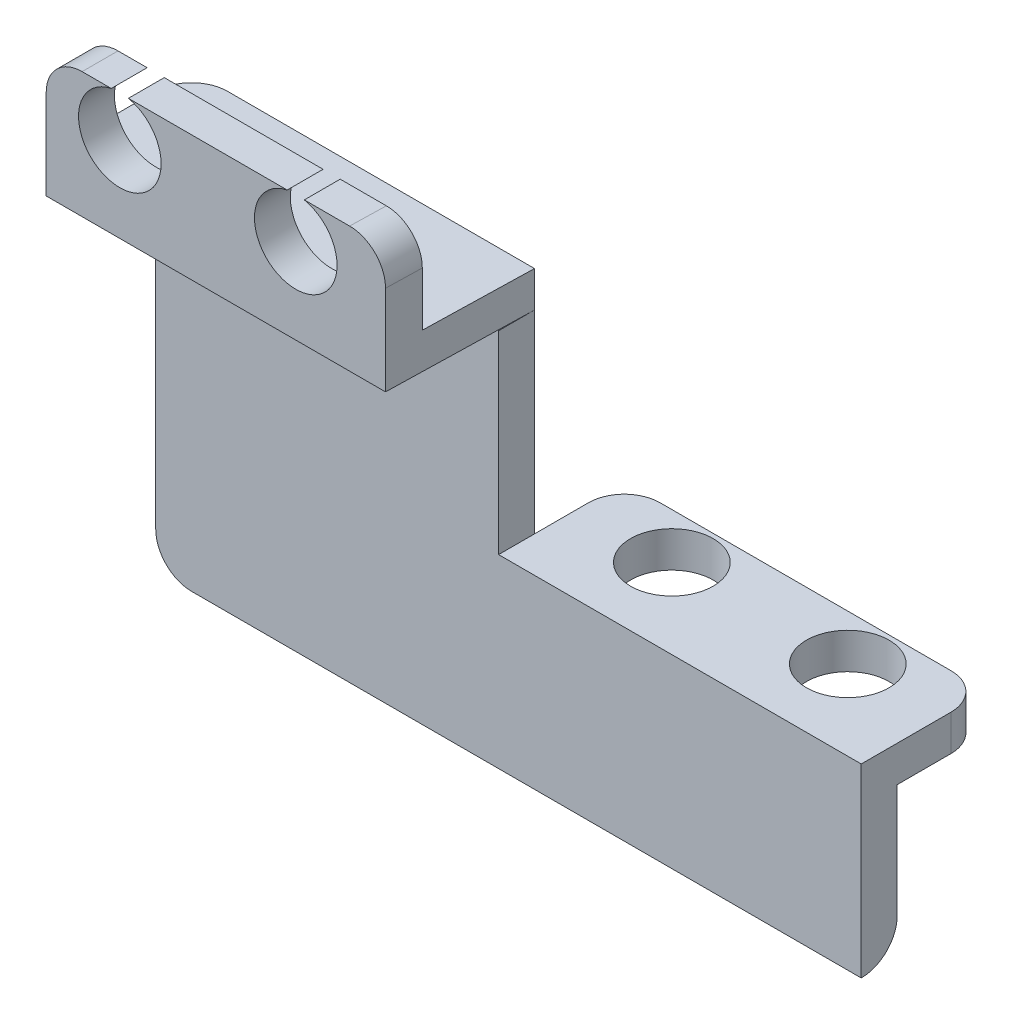
ISO-10303-21;
HEADER;
FILE_DESCRIPTION(('STEP AP214'),'2;1');
FILE_NAME('part.step','',(''),(''),'','','');
FILE_SCHEMA(('AUTOMOTIVE_DESIGN { 1 0 10303 214 1 1 1 1 }'));
ENDSEC;
DATA;
#1=APPLICATION_CONTEXT('core data for automotive mechanical design processes');
#2=APPLICATION_PROTOCOL_DEFINITION('international standard','automotive_design',2000,#1);
#3=PRODUCT_CONTEXT('',#1,'mechanical');
#4=PRODUCT('Part','Part','',(#3));
#5=PRODUCT_RELATED_PRODUCT_CATEGORY('part','',(#4));
#6=PRODUCT_DEFINITION_FORMATION('','',#4);
#7=PRODUCT_DEFINITION_CONTEXT('part definition',#1,'design');
#8=PRODUCT_DEFINITION('design','',#6,#7);
#9=PRODUCT_DEFINITION_SHAPE('','',#8);
#10=(LENGTH_UNIT() NAMED_UNIT(*) SI_UNIT(.MILLI.,.METRE.));
#11=(NAMED_UNIT(*) PLANE_ANGLE_UNIT() SI_UNIT($,.RADIAN.));
#12=(NAMED_UNIT(*) SI_UNIT($,.STERADIAN.) SOLID_ANGLE_UNIT());
#13=UNCERTAINTY_MEASURE_WITH_UNIT(LENGTH_MEASURE(1.E-05),#10,'distance_accuracy_value','');
#14=(GEOMETRIC_REPRESENTATION_CONTEXT(3) GLOBAL_UNCERTAINTY_ASSIGNED_CONTEXT((#13)) GLOBAL_UNIT_ASSIGNED_CONTEXT((#10,
#11,#12)) REPRESENTATION_CONTEXT('',''));
#15=CARTESIAN_POINT('',(0.,0.,0.));
#16=DIRECTION('',(0.,0.,1.));
#17=DIRECTION('',(1.,0.,0.));
#18=AXIS2_PLACEMENT_3D('',#15,#16,#17);
#19=CARTESIAN_POINT('',(0.,38.45,0.));
#20=DIRECTION('',(0.,1.,0.));
#21=DIRECTION('',(0.,0.,-1.));
#22=AXIS2_PLACEMENT_3D('',#19,#20,#21);
#23=PLANE('',#22);
#24=DIRECTION('',(0.,0.,-1.));
#25=VECTOR('',#24,1.);
#26=CARTESIAN_POINT('',(-15.7769696007085,38.45,6.10060938453578));
#27=LINE('',#26,#25);
#28=CARTESIAN_POINT('',(-15.7769696007085,38.45,6.1));
#29=VERTEX_POINT('',#28);
#30=CARTESIAN_POINT('',(-15.7769696007085,38.45,4.10060938453578));
#31=VERTEX_POINT('',#30);
#32=EDGE_CURVE('E11',#29,#31,#27,.T.);
#33=ORIENTED_EDGE('',*,*,#32,.T.);
#34=DIRECTION('',(1.,0.,0.));
#35=VECTOR('',#34,1.);
#36=CARTESIAN_POINT('',(-10.2506323304824,38.45,4.10060938453578));
#37=LINE('',#36,#35);
#38=CARTESIAN_POINT('',(-24.6230303992915,38.45,4.10060938453578));
#39=VERTEX_POINT('',#38);
#40=EDGE_CURVE('E210',#39,#31,#37,.T.);
#41=ORIENTED_EDGE('',*,*,#40,.F.);
#42=DIRECTION('',(0.,0.,-1.));
#43=VECTOR('',#42,1.);
#44=CARTESIAN_POINT('',(-24.6230303992915,38.45,6.10060938453578));
#45=LINE('',#44,#43);
#46=CARTESIAN_POINT('',(-24.6230303992915,38.45,6.1));
#47=VERTEX_POINT('',#46);
#48=EDGE_CURVE('E196',#39,#47,#45,.F.);
#49=ORIENTED_EDGE('',*,*,#48,.T.);
#50=DIRECTION('',(-1.,0.,0.));
#51=VECTOR('',#50,1.);
#52=CARTESIAN_POINT('',(-10.3,38.45,6.1));
#53=LINE('',#52,#51);
#54=EDGE_CURVE('E380',#29,#47,#53,.T.);
#55=ORIENTED_EDGE('',*,*,#54,.F.);
#56=EDGE_LOOP('',(#33,#41,#49,#55));
#57=FACE_BOUND('',#56,.T.);
#58=ADVANCED_FACE('F41',(#57),#23,.T.);
#59=DIRECTION('',(0.,0.,-1.));
#60=VECTOR('',#59,1.);
#61=CARTESIAN_POINT('',(-25.5769696007085,38.45,6.10060938453578));
#62=LINE('',#61,#60);
#63=CARTESIAN_POINT('',(-25.5769696007085,38.45,6.1));
#64=VERTEX_POINT('',#63);
#65=CARTESIAN_POINT('',(-25.5769696007085,38.45,4.10060938453578));
#66=VERTEX_POINT('',#65);
#67=EDGE_CURVE('E194',#64,#66,#62,.T.);
#68=ORIENTED_EDGE('',*,*,#67,.T.);
#69=CARTESIAN_POINT('',(-27.2,38.45,4.10060938453578));
#70=VERTEX_POINT('',#69);
#71=EDGE_CURVE('E201',#70,#66,#37,.T.);
#72=ORIENTED_EDGE('',*,*,#71,.F.);
#73=DIRECTION('',(0.,0.,-1.));
#74=VECTOR('',#73,1.);
#75=CARTESIAN_POINT('',(-27.2,38.45,4.10060938453578));
#76=LINE('',#75,#74);
#77=CARTESIAN_POINT('',(-27.2,38.45,6.1));
#78=VERTEX_POINT('',#77);
#79=EDGE_CURVE('E250',#78,#70,#76,.T.);
#80=ORIENTED_EDGE('',*,*,#79,.F.);
#81=EDGE_CURVE('E216',#64,#78,#53,.T.);
#82=ORIENTED_EDGE('',*,*,#81,.F.);
#83=EDGE_LOOP('',(#68,#72,#80,#82));
#84=FACE_BOUND('',#83,.T.);
#85=ADVANCED_FACE('F214',(#84),#23,.T.);
#86=CARTESIAN_POINT('',(0.,0.,-2.));
#87=DIRECTION('',(0.,0.,1.));
#88=DIRECTION('',(-1.,0.,0.));
#89=AXIS2_PLACEMENT_3D('',#86,#87,#88);
#90=PLANE('',#89);
#91=DIRECTION('',(0.,-1.,0.));
#92=VECTOR('',#91,1.);
#93=CARTESIAN_POINT('',(-27.2,0.,-2.));
#94=LINE('',#93,#92);
#95=CARTESIAN_POINT('',(-27.2,33.45,-2.));
#96=VERTEX_POINT('',#95);
#97=CARTESIAN_POINT('',(-27.2,12.325,-2.));
#98=VERTEX_POINT('',#97);
#99=EDGE_CURVE('E241',#96,#98,#94,.T.);
#100=ORIENTED_EDGE('',*,*,#99,.F.);
#101=DIRECTION('',(1.,0.,0.));
#102=VECTOR('',#101,1.);
#103=CARTESIAN_POINT('',(0.,33.45,-2.));
#104=LINE('',#103,#102);
#105=CARTESIAN_POINT('',(-10.1,33.45,-2.));
#106=VERTEX_POINT('',#105);
#107=EDGE_CURVE('E367',#96,#106,#104,.T.);
#108=ORIENTED_EDGE('',*,*,#107,.T.);
#109=DIRECTION('',(0.,-1.,0.));
#110=VECTOR('',#109,1.);
#111=CARTESIAN_POINT('',(-10.1,33.45,-2.));
#112=LINE('',#111,#110);
#113=CARTESIAN_POINT('',(-10.1,31.45,-2.));
#114=VERTEX_POINT('',#113);
#115=EDGE_CURVE('E350',#106,#114,#112,.T.);
#116=ORIENTED_EDGE('',*,*,#115,.T.);
#117=DIRECTION('',(0.,1.,0.));
#118=VECTOR('',#117,1.);
#119=CARTESIAN_POINT('',(-10.1,20.65,-2.));
#120=LINE('',#119,#118);
#121=CARTESIAN_POINT('',(-10.1,20.65,-2.));
#122=VERTEX_POINT('',#121);
#123=EDGE_CURVE('E292',#122,#114,#120,.T.);
#124=ORIENTED_EDGE('',*,*,#123,.F.);
#125=DIRECTION('',(0.,-1.,0.));
#126=VECTOR('',#125,1.);
#127=CARTESIAN_POINT('',(-10.1,20.65,-2.));
#128=LINE('',#127,#126);
#129=CARTESIAN_POINT('',(-10.1,18.65,-2.));
#130=VERTEX_POINT('',#129);
#131=EDGE_CURVE('E328',#122,#130,#128,.T.);
#132=ORIENTED_EDGE('',*,*,#131,.T.);
#133=DIRECTION('',(1.,0.,0.));
#134=VECTOR('',#133,1.);
#135=CARTESIAN_POINT('',(-10.1,18.65,-2.));
#136=LINE('',#135,#134);
#137=CARTESIAN_POINT('',(10.1,18.65,-2.));
#138=VERTEX_POINT('',#137);
#139=EDGE_CURVE('E324',#130,#138,#136,.T.);
#140=ORIENTED_EDGE('',*,*,#139,.T.);
#141=DIRECTION('',(0.,1.,0.));
#142=VECTOR('',#141,1.);
#143=CARTESIAN_POINT('',(10.1,20.65,-2.));
#144=LINE('',#143,#142);
#145=CARTESIAN_POINT('',(10.1,12.325,-2.));
#146=VERTEX_POINT('',#145);
#147=EDGE_CURVE('E296',#146,#138,#144,.T.);
#148=ORIENTED_EDGE('',*,*,#147,.F.);
#149=DIRECTION('',(1.,0.,0.));
#150=VECTOR('',#149,1.);
#151=CARTESIAN_POINT('',(0.,12.325,-2.));
#152=LINE('',#151,#150);
#153=EDGE_CURVE('E227',#98,#146,#152,.T.);
#154=ORIENTED_EDGE('',*,*,#153,.F.);
#155=EDGE_LOOP('',(#100,#108,#116,#124,#132,#140,#148,#154));
#156=FACE_BOUND('',#155,.T.);
#157=ADVANCED_FACE('F428',(#156),#90,.F.);
#158=CARTESIAN_POINT('',(10.1,20.65,-2.));
#159=DIRECTION('',(-1.,0.,0.));
#160=DIRECTION('',(0.,0.,-1.));
#161=AXIS2_PLACEMENT_3D('',#158,#159,#160);
#162=PLANE('',#161);
#163=ORIENTED_EDGE('',*,*,#147,.T.);
#164=DIRECTION('',(0.,0.,1.));
#165=VECTOR('',#164,1.);
#166=CARTESIAN_POINT('',(10.1,18.65,-7.));
#167=LINE('',#166,#165);
#168=CARTESIAN_POINT('',(10.1,18.65,-5.));
#169=VERTEX_POINT('',#168);
#170=EDGE_CURVE('E321',#169,#138,#167,.T.);
#171=ORIENTED_EDGE('',*,*,#170,.F.);
#172=DIRECTION('',(0.,1.,0.));
#173=VECTOR('',#172,1.);
#174=CARTESIAN_POINT('',(10.1,18.65,-5.));
#175=LINE('',#174,#173);
#176=CARTESIAN_POINT('',(10.1,20.65,-5.));
#177=VERTEX_POINT('',#176);
#178=EDGE_CURVE('E276',#177,#169,#175,.F.);
#179=ORIENTED_EDGE('',*,*,#178,.F.);
#180=DIRECTION('',(0.,0.,1.));
#181=VECTOR('',#180,1.);
#182=CARTESIAN_POINT('',(10.1,20.65,-2.));
#183=LINE('',#182,#181);
#184=CARTESIAN_POINT('',(10.1,20.65,0.));
#185=VERTEX_POINT('',#184);
#186=EDGE_CURVE('E283',#177,#185,#183,.T.);
#187=ORIENTED_EDGE('',*,*,#186,.T.);
#188=DIRECTION('',(0.,1.,0.));
#189=VECTOR('',#188,1.);
#190=CARTESIAN_POINT('',(10.1,20.65,0.));
#191=LINE('',#190,#189);
#192=CARTESIAN_POINT('',(10.1,10.325,0.));
#193=VERTEX_POINT('',#192);
#194=EDGE_CURVE('E307',#193,#185,#191,.T.);
#195=ORIENTED_EDGE('',*,*,#194,.F.);
#196=CARTESIAN_POINT('',(10.1,12.325,0.));
#197=DIRECTION('',(1.,0.,0.));
#198=DIRECTION('',(0.,0.,-1.));
#199=AXIS2_PLACEMENT_3D('',#196,#197,#198);
#200=CIRCLE('',#199,2.);
#201=EDGE_CURVE('E218',#146,#193,#200,.F.);
#202=ORIENTED_EDGE('',*,*,#201,.F.);
#203=EDGE_LOOP('',(#163,#171,#179,#187,#195,#202));
#204=FACE_BOUND('',#203,.T.);
#205=ADVANCED_FACE('F474',(#204),#162,.F.);
#206=CARTESIAN_POINT('',(-10.1,20.65,-2.));
#207=DIRECTION('',(0.,-1.,0.));
#208=DIRECTION('',(0.,0.,1.));
#209=AXIS2_PLACEMENT_3D('',#206,#207,#208);
#210=PLANE('',#209);
#211=CARTESIAN_POINT('',(-4.9,20.65,-4.44999999999999));
#212=DIRECTION('',(0.,1.,0.));
#213=DIRECTION('',(0.,0.,1.));
#214=AXIS2_PLACEMENT_3D('',#211,#212,#213);
#215=CIRCLE('',#214,2.3);
#216=CARTESIAN_POINT('',(-4.9,20.65,-2.14999999999999));
#217=VERTEX_POINT('',#216);
#218=EDGE_CURVE('E331',#217,#217,#215,.T.);
#219=ORIENTED_EDGE('',*,*,#218,.F.);
#220=EDGE_LOOP('',(#219));
#221=FACE_BOUND('',#220,.T.);
#222=CARTESIAN_POINT('',(4.9,20.65,-4.44999999999999));
#223=DIRECTION('',(0.,1.,0.));
#224=DIRECTION('',(0.,0.,1.));
#225=AXIS2_PLACEMENT_3D('',#222,#223,#224);
#226=CIRCLE('',#225,2.3);
#227=CARTESIAN_POINT('',(4.9,20.65,-2.14999999999999));
#228=VERTEX_POINT('',#227);
#229=EDGE_CURVE('E339',#228,#228,#226,.T.);
#230=ORIENTED_EDGE('',*,*,#229,.F.);
#231=EDGE_LOOP('',(#230));
#232=FACE_BOUND('',#231,.T.);
#233=DIRECTION('',(0.,0.,1.));
#234=VECTOR('',#233,1.);
#235=CARTESIAN_POINT('',(-10.1,20.65,-7.));
#236=LINE('',#235,#234);
#237=CARTESIAN_POINT('',(-10.1,20.65,-5.));
#238=VERTEX_POINT('',#237);
#239=EDGE_CURVE('E312',#238,#122,#236,.T.);
#240=ORIENTED_EDGE('',*,*,#239,.T.);
#241=DIRECTION('',(0.,0.,1.));
#242=VECTOR('',#241,1.);
#243=CARTESIAN_POINT('',(-10.1,20.65,-2.));
#244=LINE('',#243,#242);
#245=CARTESIAN_POINT('',(-10.1,20.65,0.));
#246=VERTEX_POINT('',#245);
#247=EDGE_CURVE('E286',#122,#246,#244,.T.);
#248=ORIENTED_EDGE('',*,*,#247,.T.);
#249=DIRECTION('',(-1.,0.,0.));
#250=VECTOR('',#249,1.);
#251=CARTESIAN_POINT('',(-10.1,20.65,0.));
#252=LINE('',#251,#250);
#253=EDGE_CURVE('E304',#185,#246,#252,.T.);
#254=ORIENTED_EDGE('',*,*,#253,.F.);
#255=ORIENTED_EDGE('',*,*,#186,.F.);
#256=CARTESIAN_POINT('',(8.1,20.65,-5.));
#257=DIRECTION('',(0.,1.,0.));
#258=DIRECTION('',(0.,0.,1.));
#259=AXIS2_PLACEMENT_3D('',#256,#257,#258);
#260=CIRCLE('',#259,2.);
#261=CARTESIAN_POINT('',(8.1,20.65,-7.));
#262=VERTEX_POINT('',#261);
#263=EDGE_CURVE('E279',#262,#177,#260,.F.);
#264=ORIENTED_EDGE('',*,*,#263,.F.);
#265=DIRECTION('',(-1.,0.,0.));
#266=VECTOR('',#265,1.);
#267=CARTESIAN_POINT('',(10.1,20.65,-7.));
#268=LINE('',#267,#266);
#269=CARTESIAN_POINT('',(-8.1,20.65,-7.));
#270=VERTEX_POINT('',#269);
#271=EDGE_CURVE('E327',#262,#270,#268,.T.);
#272=ORIENTED_EDGE('',*,*,#271,.T.);
#273=CARTESIAN_POINT('',(-8.1,20.65,-5.));
#274=DIRECTION('',(0.,1.,0.));
#275=DIRECTION('',(0.,0.,1.));
#276=AXIS2_PLACEMENT_3D('',#273,#274,#275);
#277=CIRCLE('',#276,2.);
#278=EDGE_CURVE('E264',#238,#270,#277,.F.);
#279=ORIENTED_EDGE('',*,*,#278,.F.);
#280=EDGE_LOOP('',(#240,#248,#254,#255,#264,#272,#279));
#281=FACE_BOUND('',#280,.T.);
#282=ADVANCED_FACE('F488',(#221,#232,#281),#210,.F.);
#283=CARTESIAN_POINT('',(-10.1,20.65,-2.));
#284=DIRECTION('',(-1.,0.,0.));
#285=DIRECTION('',(0.,0.,-1.));
#286=AXIS2_PLACEMENT_3D('',#283,#284,#285);
#287=PLANE('',#286);
#288=DIRECTION('',(0.,1.,0.));
#289=VECTOR('',#288,1.);
#290=CARTESIAN_POINT('',(-10.1,20.65,0.));
#291=LINE('',#290,#289);
#292=CARTESIAN_POINT('',(-10.1,31.45,0.));
#293=VERTEX_POINT('',#292);
#294=EDGE_CURVE('E301',#246,#293,#291,.T.);
#295=ORIENTED_EDGE('',*,*,#294,.F.);
#296=ORIENTED_EDGE('',*,*,#247,.F.);
#297=ORIENTED_EDGE('',*,*,#123,.T.);
#298=DIRECTION('',(0.,0.,1.));
#299=VECTOR('',#298,1.);
#300=CARTESIAN_POINT('',(-10.1,31.45,-2.));
#301=LINE('',#300,#299);
#302=EDGE_CURVE('E289',#114,#293,#301,.T.);
#303=ORIENTED_EDGE('',*,*,#302,.T.);
#304=EDGE_LOOP('',(#295,#296,#297,#303));
#305=FACE_BOUND('',#304,.T.);
#306=ADVANCED_FACE('F484',(#305),#287,.F.);
#307=CARTESIAN_POINT('',(-10.1,31.45,-2.));
#308=DIRECTION('',(0.,-1.,0.));
#309=DIRECTION('',(0.,0.,1.));
#310=AXIS2_PLACEMENT_3D('',#307,#308,#309);
#311=PLANE('',#310);
#312=DIRECTION('',(-1.,0.,0.));
#313=VECTOR('',#312,1.);
#314=CARTESIAN_POINT('',(-10.1,31.45,0.));
#315=LINE('',#314,#313);
#316=CARTESIAN_POINT('',(-10.1493827160494,31.45,0.));
#317=VERTEX_POINT('',#316);
#318=EDGE_CURVE('E297',#293,#317,#315,.T.);
#319=ORIENTED_EDGE('',*,*,#318,.F.);
#320=ORIENTED_EDGE('',*,*,#302,.F.);
#321=DIRECTION('',(0.0246838347588167,0.,-0.999695307732111));
#322=VECTOR('',#321,1.);
#323=CARTESIAN_POINT('',(-10.1431987814166,31.45,-0.250449352627562));
#324=LINE('',#323,#322);
#325=EDGE_CURVE('E263',#317,#114,#324,.T.);
#326=ORIENTED_EDGE('',*,*,#325,.F.);
#327=EDGE_LOOP('',(#319,#320,#326));
#328=FACE_BOUND('',#327,.T.);
#329=ADVANCED_FACE('F481',(#328),#311,.F.);
#330=CARTESIAN_POINT('',(-29.2,17.5673505417819,-2.));
#331=DIRECTION('',(1.,0.,0.));
#332=DIRECTION('',(0.,1.,0.));
#333=AXIS2_PLACEMENT_3D('',#330,#331,#332);
#334=PLANE('',#333);
#335=DIRECTION('',(0.,0.,-1.));
#336=VECTOR('',#335,1.);
#337=CARTESIAN_POINT('',(-29.2,31.45,0.));
#338=LINE('',#337,#336);
#339=CARTESIAN_POINT('',(-29.2,31.45,6.1));
#340=VERTEX_POINT('',#339);
#341=CARTESIAN_POINT('',(-29.2,31.45,0.));
#342=VERTEX_POINT('',#341);
#343=EDGE_CURVE('E359',#340,#342,#338,.T.);
#344=ORIENTED_EDGE('',*,*,#343,.F.);
#345=DIRECTION('',(0.,-1.,0.));
#346=VECTOR('',#345,1.);
#347=CARTESIAN_POINT('',(-29.2,33.45,6.1));
#348=LINE('',#347,#346);
#349=CARTESIAN_POINT('',(-29.2,36.45,6.1));
#350=VERTEX_POINT('',#349);
#351=EDGE_CURVE('E340',#350,#340,#348,.T.);
#352=ORIENTED_EDGE('',*,*,#351,.F.);
#353=DIRECTION('',(0.,0.,-1.));
#354=VECTOR('',#353,1.);
#355=CARTESIAN_POINT('',(-29.2,36.45,6.1));
#356=LINE('',#355,#354);
#357=CARTESIAN_POINT('',(-29.2,36.45,4.10060938453578));
#358=VERTEX_POINT('',#357);
#359=EDGE_CURVE('E246',#358,#350,#356,.F.);
#360=ORIENTED_EDGE('',*,*,#359,.F.);
#361=DIRECTION('',(0.,-1.,0.));
#362=VECTOR('',#361,1.);
#363=CARTESIAN_POINT('',(-29.2,38.45,4.10060938453578));
#364=LINE('',#363,#362);
#365=CARTESIAN_POINT('',(-29.2,33.45,4.10060938453578));
#366=VERTEX_POINT('',#365);
#367=EDGE_CURVE('E365',#358,#366,#364,.T.);
#368=ORIENTED_EDGE('',*,*,#367,.T.);
#369=DIRECTION('',(0.,0.,-1.));
#370=VECTOR('',#369,1.);
#371=CARTESIAN_POINT('',(-29.2,33.45,0.));
#372=LINE('',#371,#370);
#373=CARTESIAN_POINT('',(-29.2,33.45,0.));
#374=VERTEX_POINT('',#373);
#375=EDGE_CURVE('E358',#366,#374,#372,.T.);
#376=ORIENTED_EDGE('',*,*,#375,.T.);
#377=DIRECTION('',(0.,-1.,0.));
#378=VECTOR('',#377,1.);
#379=CARTESIAN_POINT('',(-29.2,17.5673505417819,0.));
#380=LINE('',#379,#378);
#381=EDGE_CURVE('E238',#342,#374,#380,.F.);
#382=ORIENTED_EDGE('',*,*,#381,.F.);
#383=EDGE_LOOP('',(#344,#352,#360,#368,#376,#382));
#384=FACE_BOUND('',#383,.T.);
#385=ADVANCED_FACE('F406',(#384),#334,.F.);
#386=CARTESIAN_POINT('',(0.,0.,0.));
#387=DIRECTION('',(0.,0.,1.));
#388=DIRECTION('',(-1.,0.,0.));
#389=AXIS2_PLACEMENT_3D('',#386,#387,#388);
#390=PLANE('',#389);
#391=DIRECTION('',(1.,0.,0.));
#392=VECTOR('',#391,1.);
#393=CARTESIAN_POINT('',(-10.1,10.325,0.));
#394=LINE('',#393,#392);
#395=CARTESIAN_POINT('',(-27.2,10.325,0.));
#396=VERTEX_POINT('',#395);
#397=EDGE_CURVE('E310',#396,#193,#394,.T.);
#398=ORIENTED_EDGE('',*,*,#397,.T.);
#399=ORIENTED_EDGE('',*,*,#194,.T.);
#400=ORIENTED_EDGE('',*,*,#253,.T.);
#401=ORIENTED_EDGE('',*,*,#294,.T.);
#402=ORIENTED_EDGE('',*,*,#318,.T.);
#403=EDGE_CURVE('E300',#317,#342,#315,.T.);
#404=ORIENTED_EDGE('',*,*,#403,.T.);
#405=DIRECTION('',(0.,-1.,0.));
#406=VECTOR('',#405,1.);
#407=CARTESIAN_POINT('',(-29.2,17.5673505417819,0.));
#408=LINE('',#407,#406);
#409=CARTESIAN_POINT('',(-29.2,12.325,0.));
#410=VERTEX_POINT('',#409);
#411=EDGE_CURVE('E293',#342,#410,#408,.T.);
#412=ORIENTED_EDGE('',*,*,#411,.T.);
#413=CARTESIAN_POINT('',(-27.2,12.325,0.));
#414=DIRECTION('',(0.,0.,-1.));
#415=DIRECTION('',(-1.,0.,0.));
#416=AXIS2_PLACEMENT_3D('',#413,#414,#415);
#417=CIRCLE('',#416,2.);
#418=EDGE_CURVE('E233',#396,#410,#417,.T.);
#419=ORIENTED_EDGE('',*,*,#418,.F.);
#420=EDGE_LOOP('',(#398,#399,#400,#401,#402,#404,#412,#419));
#421=FACE_BOUND('',#420,.T.);
#422=ADVANCED_FACE('F470',(#421),#390,.T.);
#423=CARTESIAN_POINT('',(-10.1,20.65,-7.));
#424=DIRECTION('',(1.,0.,0.));
#425=DIRECTION('',(0.,0.,1.));
#426=AXIS2_PLACEMENT_3D('',#423,#424,#425);
#427=PLANE('',#426);
#428=DIRECTION('',(0.,0.,1.));
#429=VECTOR('',#428,1.);
#430=CARTESIAN_POINT('',(-10.1,18.65,-7.));
#431=LINE('',#430,#429);
#432=CARTESIAN_POINT('',(-10.1,18.65,-5.));
#433=VERTEX_POINT('',#432);
#434=EDGE_CURVE('E319',#433,#130,#431,.T.);
#435=ORIENTED_EDGE('',*,*,#434,.T.);
#436=ORIENTED_EDGE('',*,*,#131,.F.);
#437=ORIENTED_EDGE('',*,*,#239,.F.);
#438=DIRECTION('',(0.,-1.,0.));
#439=VECTOR('',#438,1.);
#440=CARTESIAN_POINT('',(-10.1,20.65,-5.));
#441=LINE('',#440,#439);
#442=EDGE_CURVE('E267',#433,#238,#441,.F.);
#443=ORIENTED_EDGE('',*,*,#442,.F.);
#444=EDGE_LOOP('',(#435,#436,#437,#443));
#445=FACE_BOUND('',#444,.T.);
#446=ADVANCED_FACE('F466',(#445),#427,.F.);
#447=CARTESIAN_POINT('',(-10.1,18.65,-7.));
#448=DIRECTION('',(0.,1.,0.));
#449=DIRECTION('',(0.,0.,-1.));
#450=AXIS2_PLACEMENT_3D('',#447,#448,#449);
#451=PLANE('',#450);
#452=CARTESIAN_POINT('',(-4.9,18.65,-4.44999999999999));
#453=DIRECTION('',(0.,1.,0.));
#454=DIRECTION('',(0.,0.,1.));
#455=AXIS2_PLACEMENT_3D('',#452,#453,#454);
#456=CIRCLE('',#455,2.3);
#457=CARTESIAN_POINT('',(-4.9,18.65,-2.14999999999999));
#458=VERTEX_POINT('',#457);
#459=EDGE_CURVE('E343',#458,#458,#456,.T.);
#460=ORIENTED_EDGE('',*,*,#459,.T.);
#461=EDGE_LOOP('',(#460));
#462=FACE_BOUND('',#461,.T.);
#463=CARTESIAN_POINT('',(4.9,18.65,-4.44999999999999));
#464=DIRECTION('',(0.,1.,0.));
#465=DIRECTION('',(0.,0.,1.));
#466=AXIS2_PLACEMENT_3D('',#463,#464,#465);
#467=CIRCLE('',#466,2.3);
#468=CARTESIAN_POINT('',(4.9,18.65,-2.14999999999999));
#469=VERTEX_POINT('',#468);
#470=EDGE_CURVE('E336',#469,#469,#467,.T.);
#471=ORIENTED_EDGE('',*,*,#470,.T.);
#472=EDGE_LOOP('',(#471));
#473=FACE_BOUND('',#472,.T.);
#474=DIRECTION('',(1.,0.,0.));
#475=VECTOR('',#474,1.);
#476=CARTESIAN_POINT('',(-10.1,18.65,-7.));
#477=LINE('',#476,#475);
#478=CARTESIAN_POINT('',(-8.1,18.65,-7.));
#479=VERTEX_POINT('',#478);
#480=CARTESIAN_POINT('',(8.1,18.65,-7.));
#481=VERTEX_POINT('',#480);
#482=EDGE_CURVE('E323',#479,#481,#477,.T.);
#483=ORIENTED_EDGE('',*,*,#482,.T.);
#484=CARTESIAN_POINT('',(8.1,18.65,-5.));
#485=DIRECTION('',(0.,-1.,0.));
#486=DIRECTION('',(0.,0.,-1.));
#487=AXIS2_PLACEMENT_3D('',#484,#485,#486);
#488=CIRCLE('',#487,2.);
#489=EDGE_CURVE('E273',#169,#481,#488,.F.);
#490=ORIENTED_EDGE('',*,*,#489,.F.);
#491=ORIENTED_EDGE('',*,*,#170,.T.);
#492=ORIENTED_EDGE('',*,*,#139,.F.);
#493=ORIENTED_EDGE('',*,*,#434,.F.);
#494=CARTESIAN_POINT('',(-8.1,18.65,-5.));
#495=DIRECTION('',(0.,-1.,0.));
#496=DIRECTION('',(0.,0.,-1.));
#497=AXIS2_PLACEMENT_3D('',#494,#495,#496);
#498=CIRCLE('',#497,2.);
#499=EDGE_CURVE('E269',#479,#433,#498,.F.);
#500=ORIENTED_EDGE('',*,*,#499,.F.);
#501=EDGE_LOOP('',(#483,#490,#491,#492,#493,#500));
#502=FACE_BOUND('',#501,.T.);
#503=ADVANCED_FACE('F462',(#462,#473,#502),#451,.F.);
#504=CARTESIAN_POINT('',(0.,0.,-7.));
#505=DIRECTION('',(0.,0.,-1.));
#506=DIRECTION('',(1.,0.,0.));
#507=AXIS2_PLACEMENT_3D('',#504,#505,#506);
#508=PLANE('',#507);
#509=ORIENTED_EDGE('',*,*,#271,.F.);
#510=DIRECTION('',(0.,1.,0.));
#511=VECTOR('',#510,1.);
#512=CARTESIAN_POINT('',(8.1,20.65,-7.));
#513=LINE('',#512,#511);
#514=EDGE_CURVE('E281',#481,#262,#513,.T.);
#515=ORIENTED_EDGE('',*,*,#514,.F.);
#516=ORIENTED_EDGE('',*,*,#482,.F.);
#517=DIRECTION('',(0.,-1.,0.));
#518=VECTOR('',#517,1.);
#519=CARTESIAN_POINT('',(-8.1,18.65,-7.));
#520=LINE('',#519,#518);
#521=EDGE_CURVE('E271',#270,#479,#520,.T.);
#522=ORIENTED_EDGE('',*,*,#521,.F.);
#523=EDGE_LOOP('',(#509,#515,#516,#522));
#524=FACE_BOUND('',#523,.T.);
#525=ADVANCED_FACE('F458',(#524),#508,.T.);
#526=CARTESIAN_POINT('',(8.1,0.,-5.));
#527=DIRECTION('',(0.,-1.,0.));
#528=DIRECTION('',(0.,0.,1.));
#529=AXIS2_PLACEMENT_3D('',#526,#527,#528);
#530=CYLINDRICAL_SURFACE('',#529,2.);
#531=ORIENTED_EDGE('',*,*,#489,.T.);
#532=ORIENTED_EDGE('',*,*,#514,.T.);
#533=ORIENTED_EDGE('',*,*,#263,.T.);
#534=ORIENTED_EDGE('',*,*,#178,.T.);
#535=EDGE_LOOP('',(#531,#532,#533,#534));
#536=FACE_BOUND('',#535,.T.);
#537=ADVANCED_FACE('F461',(#536),#530,.T.);
#538=CARTESIAN_POINT('',(-8.1,0.,-5.));
#539=DIRECTION('',(0.,1.,0.));
#540=DIRECTION('',(0.,0.,-1.));
#541=AXIS2_PLACEMENT_3D('',#538,#539,#540);
#542=CYLINDRICAL_SURFACE('',#541,2.);
#543=ORIENTED_EDGE('',*,*,#278,.T.);
#544=ORIENTED_EDGE('',*,*,#521,.T.);
#545=ORIENTED_EDGE('',*,*,#499,.T.);
#546=ORIENTED_EDGE('',*,*,#442,.T.);
#547=EDGE_LOOP('',(#543,#544,#545,#546));
#548=FACE_BOUND('',#547,.T.);
#549=ADVANCED_FACE('F456',(#548),#542,.T.);
#550=CARTESIAN_POINT('',(4.9,20.65,-4.44999999999999));
#551=DIRECTION('',(0.,-1.,0.));
#552=DIRECTION('',(0.,0.,1.));
#553=AXIS2_PLACEMENT_3D('',#550,#551,#552);
#554=CYLINDRICAL_SURFACE('',#553,2.3);
#555=ORIENTED_EDGE('',*,*,#229,.T.);
#556=EDGE_LOOP('',(#555));
#557=FACE_BOUND('',#556,.T.);
#558=ORIENTED_EDGE('',*,*,#470,.F.);
#559=EDGE_LOOP('',(#558));
#560=FACE_BOUND('',#559,.T.);
#561=ADVANCED_FACE('F452',(#557,#560),#554,.F.);
#562=CARTESIAN_POINT('',(-4.9,20.65,-4.44999999999999));
#563=DIRECTION('',(0.,-1.,0.));
#564=DIRECTION('',(0.,0.,1.));
#565=AXIS2_PLACEMENT_3D('',#562,#563,#564);
#566=CYLINDRICAL_SURFACE('',#565,2.3);
#567=ORIENTED_EDGE('',*,*,#218,.T.);
#568=EDGE_LOOP('',(#567));
#569=FACE_BOUND('',#568,.T.);
#570=ORIENTED_EDGE('',*,*,#459,.F.);
#571=EDGE_LOOP('',(#570));
#572=FACE_BOUND('',#571,.T.);
#573=ADVANCED_FACE('F444',(#569,#572),#566,.F.);
#574=CARTESIAN_POINT('',(0.,31.45,0.));
#575=DIRECTION('',(0.,1.,0.));
#576=DIRECTION('',(0.,0.,-1.));
#577=AXIS2_PLACEMENT_3D('',#574,#575,#576);
#578=PLANE('',#577);
#579=CARTESIAN_POINT('',(-10.3,31.45,6.1));
#580=VERTEX_POINT('',#579);
#581=EDGE_CURVE('E356',#580,#317,#324,.T.);
#582=ORIENTED_EDGE('',*,*,#581,.F.);
#583=DIRECTION('',(1.,0.,0.));
#584=VECTOR('',#583,1.);
#585=CARTESIAN_POINT('',(0.,31.45,6.1));
#586=LINE('',#585,#584);
#587=EDGE_CURVE('E362',#340,#580,#586,.T.);
#588=ORIENTED_EDGE('',*,*,#587,.F.);
#589=ORIENTED_EDGE('',*,*,#343,.T.);
#590=ORIENTED_EDGE('',*,*,#403,.F.);
#591=EDGE_LOOP('',(#582,#588,#589,#590));
#592=FACE_BOUND('',#591,.T.);
#593=ADVANCED_FACE('F441',(#592),#578,.F.);
#594=CARTESIAN_POINT('',(0.,33.45,6.1));
#595=DIRECTION('',(0.,0.,1.));
#596=DIRECTION('',(-1.,0.,0.));
#597=AXIS2_PLACEMENT_3D('',#594,#595,#596);
#598=PLANE('',#597);
#599=CARTESIAN_POINT('',(-15.3,36.2,6.1));
#600=DIRECTION('',(0.,0.,-1.));
#601=DIRECTION('',(-1.,0.,0.));
#602=AXIS2_PLACEMENT_3D('',#599,#600,#601);
#603=CIRCLE('',#602,2.3);
#604=CARTESIAN_POINT('',(-14.8230303992915,38.45,6.1));
#605=VERTEX_POINT('',#604);
#606=EDGE_CURVE('E224',#605,#29,#603,.T.);
#607=ORIENTED_EDGE('',*,*,#606,.T.);
#608=ORIENTED_EDGE('',*,*,#54,.T.);
#609=CARTESIAN_POINT('',(-25.1,36.2,6.1));
#610=DIRECTION('',(0.,0.,-1.));
#611=DIRECTION('',(-1.,0.,0.));
#612=AXIS2_PLACEMENT_3D('',#609,#610,#611);
#613=CIRCLE('',#612,2.3);
#614=EDGE_CURVE('E382',#47,#64,#613,.T.);
#615=ORIENTED_EDGE('',*,*,#614,.T.);
#616=ORIENTED_EDGE('',*,*,#81,.T.);
#617=CARTESIAN_POINT('',(-27.2,36.45,6.1));
#618=DIRECTION('',(0.,0.,-1.));
#619=DIRECTION('',(-1.,0.,0.));
#620=AXIS2_PLACEMENT_3D('',#617,#618,#619);
#621=CIRCLE('',#620,2.);
#622=EDGE_CURVE('E244',#350,#78,#621,.T.);
#623=ORIENTED_EDGE('',*,*,#622,.F.);
#624=ORIENTED_EDGE('',*,*,#351,.T.);
#625=ORIENTED_EDGE('',*,*,#587,.T.);
#626=DIRECTION('',(0.,-1.,0.));
#627=VECTOR('',#626,1.);
#628=CARTESIAN_POINT('',(-10.3,33.45,6.1));
#629=LINE('',#628,#627);
#630=CARTESIAN_POINT('',(-10.3,36.45,6.1));
#631=VERTEX_POINT('',#630);
#632=EDGE_CURVE('E353',#631,#580,#629,.T.);
#633=ORIENTED_EDGE('',*,*,#632,.F.);
#634=CARTESIAN_POINT('',(-12.3006095702671,36.45,6.1));
#635=DIRECTION('',(0.,0.,-1.));
#636=DIRECTION('',(-1.,0.,0.));
#637=AXIS2_PLACEMENT_3D('',#634,#635,#636);
#638=ELLIPSE('',#637,2.00060957026713,2.);
#639=CARTESIAN_POINT('',(-12.3006095702671,38.45,6.1));
#640=VERTEX_POINT('',#639);
#641=EDGE_CURVE('E258',#640,#631,#638,.T.);
#642=ORIENTED_EDGE('',*,*,#641,.F.);
#643=EDGE_CURVE('E377',#640,#605,#53,.T.);
#644=ORIENTED_EDGE('',*,*,#643,.T.);
#645=EDGE_LOOP('',(#607,#608,#615,#616,#623,#624,#625,#633,#642,#644));
#646=FACE_BOUND('',#645,.T.);
#647=ADVANCED_FACE('F411',(#646),#598,.T.);
#648=CARTESIAN_POINT('',(-10.1431987814166,33.45,-0.250449352627562));
#649=DIRECTION('',(0.999695307732111,0.,0.0246838347588167));
#650=DIRECTION('',(-0.0246838347588167,0.,0.999695307732111));
#651=AXIS2_PLACEMENT_3D('',#648,#649,#650);
#652=PLANE('',#651);
#653=ORIENTED_EDGE('',*,*,#632,.T.);
#654=ORIENTED_EDGE('',*,*,#581,.T.);
#655=ORIENTED_EDGE('',*,*,#325,.T.);
#656=ORIENTED_EDGE('',*,*,#115,.F.);
#657=DIRECTION('',(0.0246838347588167,0.,-0.999695307732111));
#658=VECTOR('',#657,1.);
#659=CARTESIAN_POINT('',(-10.1431987814166,33.45,-0.250449352627562));
#660=LINE('',#659,#658);
#661=CARTESIAN_POINT('',(-10.2506323304824,33.45,4.10060938453578));
#662=VERTEX_POINT('',#661);
#663=EDGE_CURVE('E355',#662,#106,#660,.T.);
#664=ORIENTED_EDGE('',*,*,#663,.F.);
#665=DIRECTION('',(0.,-1.,0.));
#666=VECTOR('',#665,1.);
#667=CARTESIAN_POINT('',(-10.2506323304824,38.45,4.10060938453578));
#668=LINE('',#667,#666);
#669=CARTESIAN_POINT('',(-10.2506323304824,36.45,4.10060938453578));
#670=VERTEX_POINT('',#669);
#671=EDGE_CURVE('E209',#670,#662,#668,.T.);
#672=ORIENTED_EDGE('',*,*,#671,.F.);
#673=DIRECTION('',(-0.0246838347588167,0.,0.999695307732111));
#674=VECTOR('',#673,1.);
#675=CARTESIAN_POINT('',(-10.1431987814166,36.45,-0.250449352627562));
#676=LINE('',#675,#674);
#677=EDGE_CURVE('E255',#631,#670,#676,.F.);
#678=ORIENTED_EDGE('',*,*,#677,.F.);
#679=EDGE_LOOP('',(#653,#654,#655,#656,#664,#672,#678));
#680=FACE_BOUND('',#679,.T.);
#681=ADVANCED_FACE('F397',(#680),#652,.T.);
#682=CARTESIAN_POINT('',(0.,33.45,0.));
#683=DIRECTION('',(0.,1.,0.));
#684=DIRECTION('',(0.,0.,-1.));
#685=AXIS2_PLACEMENT_3D('',#682,#683,#684);
#686=PLANE('',#685);
#687=ORIENTED_EDGE('',*,*,#375,.F.);
#688=DIRECTION('',(1.,0.,0.));
#689=VECTOR('',#688,1.);
#690=CARTESIAN_POINT('',(-10.2506323304824,33.45,4.10060938453578));
#691=LINE('',#690,#689);
#692=EDGE_CURVE('E223',#366,#662,#691,.T.);
#693=ORIENTED_EDGE('',*,*,#692,.T.);
#694=ORIENTED_EDGE('',*,*,#663,.T.);
#695=ORIENTED_EDGE('',*,*,#107,.F.);
#696=CARTESIAN_POINT('',(-27.2,33.45,0.));
#697=DIRECTION('',(0.,-1.,0.));
#698=DIRECTION('',(0.,0.,-1.));
#699=AXIS2_PLACEMENT_3D('',#696,#697,#698);
#700=CIRCLE('',#699,2.);
#701=EDGE_CURVE('E236',#374,#96,#700,.T.);
#702=ORIENTED_EDGE('',*,*,#701,.F.);
#703=EDGE_LOOP('',(#687,#693,#694,#695,#702));
#704=FACE_BOUND('',#703,.T.);
#705=ADVANCED_FACE('F400',(#704),#686,.T.);
#706=CARTESIAN_POINT('',(-10.2506323304824,38.45,4.10060938453578));
#707=DIRECTION('',(0.,0.,1.));
#708=DIRECTION('',(-1.,0.,0.));
#709=AXIS2_PLACEMENT_3D('',#706,#707,#708);
#710=PLANE('',#709);
#711=CARTESIAN_POINT('',(-14.8230303992915,38.45,4.10060938453578));
#712=VERTEX_POINT('',#711);
#713=CARTESIAN_POINT('',(-12.2512419007495,38.45,4.10060938453578));
#714=VERTEX_POINT('',#713);
#715=EDGE_CURVE('E212',#712,#714,#37,.T.);
#716=ORIENTED_EDGE('',*,*,#715,.T.);
#717=CARTESIAN_POINT('',(-12.2512419007495,36.45,4.10060938453578));
#718=DIRECTION('',(0.,0.,-1.));
#719=DIRECTION('',(-1.,0.,0.));
#720=AXIS2_PLACEMENT_3D('',#717,#718,#719);
#721=ELLIPSE('',#720,2.00060957026713,2.);
#722=EDGE_CURVE('E252',#670,#714,#721,.F.);
#723=ORIENTED_EDGE('',*,*,#722,.F.);
#724=ORIENTED_EDGE('',*,*,#671,.T.);
#725=ORIENTED_EDGE('',*,*,#692,.F.);
#726=ORIENTED_EDGE('',*,*,#367,.F.);
#727=CARTESIAN_POINT('',(-27.2,36.45,4.10060938453578));
#728=DIRECTION('',(0.,0.,-1.));
#729=DIRECTION('',(-1.,0.,0.));
#730=AXIS2_PLACEMENT_3D('',#727,#728,#729);
#731=CIRCLE('',#730,2.);
#732=EDGE_CURVE('E205',#70,#358,#731,.F.);
#733=ORIENTED_EDGE('',*,*,#732,.F.);
#734=ORIENTED_EDGE('',*,*,#71,.T.);
#735=CARTESIAN_POINT('',(-25.1,36.2,4.10060938453578));
#736=DIRECTION('',(0.,0.,1.));
#737=DIRECTION('',(1.,0.,0.));
#738=AXIS2_PLACEMENT_3D('',#735,#736,#737);
#739=CIRCLE('',#738,2.3);
#740=EDGE_CURVE('E63',#66,#39,#739,.T.);
#741=ORIENTED_EDGE('',*,*,#740,.T.);
#742=ORIENTED_EDGE('',*,*,#40,.T.);
#743=CARTESIAN_POINT('',(-15.3,36.2,4.10060938453578));
#744=DIRECTION('',(0.,0.,1.));
#745=DIRECTION('',(1.,0.,0.));
#746=AXIS2_PLACEMENT_3D('',#743,#744,#745);
#747=CIRCLE('',#746,2.3);
#748=EDGE_CURVE('E198',#31,#712,#747,.T.);
#749=ORIENTED_EDGE('',*,*,#748,.T.);
#750=EDGE_LOOP('',(#716,#723,#724,#725,#726,#733,#734,#741,#742,#749));
#751=FACE_BOUND('',#750,.T.);
#752=ADVANCED_FACE('F203',(#751),#710,.F.);
#753=DIRECTION('',(0.,0.,-1.));
#754=VECTOR('',#753,1.);
#755=CARTESIAN_POINT('',(-14.8230303992915,38.45,6.10060938453578));
#756=LINE('',#755,#754);
#757=EDGE_CURVE('E49',#712,#605,#756,.F.);
#758=ORIENTED_EDGE('',*,*,#757,.T.);
#759=ORIENTED_EDGE('',*,*,#643,.F.);
#760=DIRECTION('',(-0.0246838347588167,0.,0.999695307732111));
#761=VECTOR('',#760,1.);
#762=CARTESIAN_POINT('',(-12.1425893968808,38.45,-0.299817022145196));
#763=LINE('',#762,#761);
#764=EDGE_CURVE('E261',#714,#640,#763,.T.);
#765=ORIENTED_EDGE('',*,*,#764,.F.);
#766=ORIENTED_EDGE('',*,*,#715,.F.);
#767=EDGE_LOOP('',(#758,#759,#765,#766));
#768=FACE_BOUND('',#767,.T.);
#769=ADVANCED_FACE('F387',(#768),#23,.T.);
#770=CARTESIAN_POINT('',(-12.1425893968808,36.45,-0.299817022145196));
#771=DIRECTION('',(-0.0246838347588167,0.,0.999695307732111));
#772=DIRECTION('',(-0.999695307732111,0.,-0.0246838347588167));
#773=AXIS2_PLACEMENT_3D('',#770,#771,#772);
#774=CYLINDRICAL_SURFACE('',#773,2.);
#775=ORIENTED_EDGE('',*,*,#722,.T.);
#776=ORIENTED_EDGE('',*,*,#764,.T.);
#777=ORIENTED_EDGE('',*,*,#641,.T.);
#778=ORIENTED_EDGE('',*,*,#677,.T.);
#779=EDGE_LOOP('',(#775,#776,#777,#778));
#780=FACE_BOUND('',#779,.T.);
#781=ADVANCED_FACE('F391',(#780),#774,.T.);
#782=CARTESIAN_POINT('',(-27.2,36.45,0.));
#783=DIRECTION('',(0.,0.,1.));
#784=DIRECTION('',(-1.,0.,0.));
#785=AXIS2_PLACEMENT_3D('',#782,#783,#784);
#786=CYLINDRICAL_SURFACE('',#785,2.);
#787=ORIENTED_EDGE('',*,*,#622,.T.);
#788=ORIENTED_EDGE('',*,*,#79,.T.);
#789=ORIENTED_EDGE('',*,*,#732,.T.);
#790=ORIENTED_EDGE('',*,*,#359,.T.);
#791=EDGE_LOOP('',(#787,#788,#789,#790));
#792=FACE_BOUND('',#791,.T.);
#793=ADVANCED_FACE('F409',(#792),#786,.T.);
#794=CARTESIAN_POINT('',(-27.2,0.,0.));
#795=DIRECTION('',(0.,-1.,0.));
#796=DIRECTION('',(1.,0.,0.));
#797=AXIS2_PLACEMENT_3D('',#794,#795,#796);
#798=CYLINDRICAL_SURFACE('',#797,2.);
#799=ORIENTED_EDGE('',*,*,#411,.F.);
#800=ORIENTED_EDGE('',*,*,#381,.T.);
#801=ORIENTED_EDGE('',*,*,#701,.T.);
#802=ORIENTED_EDGE('',*,*,#99,.T.);
#803=CARTESIAN_POINT('',(-27.2,12.325,0.));
#804=DIRECTION('',(0.,1.,0.));
#805=DIRECTION('',(1.,0.,0.));
#806=AXIS2_PLACEMENT_3D('',#803,#804,#805);
#807=CIRCLE('',#806,2.);
#808=EDGE_CURVE('E230',#410,#98,#807,.F.);
#809=ORIENTED_EDGE('',*,*,#808,.F.);
#810=EDGE_LOOP('',(#799,#800,#801,#802,#809));
#811=FACE_BOUND('',#810,.T.);
#812=ADVANCED_FACE('F504',(#811),#798,.T.);
#813=CARTESIAN_POINT('',(0.,12.325,0.));
#814=DIRECTION('',(1.,0.,0.));
#815=DIRECTION('',(0.,0.,1.));
#816=AXIS2_PLACEMENT_3D('',#813,#814,#815);
#817=CYLINDRICAL_SURFACE('',#816,2.);
#818=ORIENTED_EDGE('',*,*,#201,.T.);
#819=ORIENTED_EDGE('',*,*,#397,.F.);
#820=CARTESIAN_POINT('',(-27.2,12.325,0.));
#821=DIRECTION('',(1.,0.,0.));
#822=DIRECTION('',(0.,0.,-1.));
#823=AXIS2_PLACEMENT_3D('',#820,#821,#822);
#824=CIRCLE('',#823,2.);
#825=EDGE_CURVE('E221',#396,#98,#824,.T.);
#826=ORIENTED_EDGE('',*,*,#825,.T.);
#827=ORIENTED_EDGE('',*,*,#153,.T.);
#828=EDGE_LOOP('',(#818,#819,#826,#827));
#829=FACE_BOUND('',#828,.T.);
#830=ADVANCED_FACE('F43',(#829),#817,.T.);
#831=CARTESIAN_POINT('',(-27.2,12.325,0.));
#832=DIRECTION('',(0.,1.,0.));
#833=DIRECTION('',(0.,0.,-1.));
#834=AXIS2_PLACEMENT_3D('',#831,#832,#833);
#835=SPHERICAL_SURFACE('',#834,2.);
#836=ORIENTED_EDGE('',*,*,#825,.F.);
#837=ORIENTED_EDGE('',*,*,#418,.T.);
#838=ORIENTED_EDGE('',*,*,#808,.T.);
#839=EDGE_LOOP('',(#836,#837,#838));
#840=FACE_BOUND('',#839,.T.);
#841=ADVANCED_FACE('F421',(#840),#835,.T.);
#842=CARTESIAN_POINT('',(-25.1,36.2,6.10060938453578));
#843=DIRECTION('',(0.,0.,-1.));
#844=DIRECTION('',(1.,0.,0.));
#845=AXIS2_PLACEMENT_3D('',#842,#843,#844);
#846=CYLINDRICAL_SURFACE('',#845,2.3);
#847=ORIENTED_EDGE('',*,*,#67,.F.);
#848=ORIENTED_EDGE('',*,*,#614,.F.);
#849=ORIENTED_EDGE('',*,*,#48,.F.);
#850=ORIENTED_EDGE('',*,*,#740,.F.);
#851=EDGE_LOOP('',(#847,#848,#849,#850));
#852=FACE_BOUND('',#851,.T.);
#853=ADVANCED_FACE('F192',(#852),#846,.F.);
#854=CARTESIAN_POINT('',(-15.3,36.2,6.10060938453578));
#855=DIRECTION('',(0.,0.,-1.));
#856=DIRECTION('',(1.,0.,0.));
#857=AXIS2_PLACEMENT_3D('',#854,#855,#856);
#858=CYLINDRICAL_SURFACE('',#857,2.3);
#859=ORIENTED_EDGE('',*,*,#32,.F.);
#860=ORIENTED_EDGE('',*,*,#606,.F.);
#861=ORIENTED_EDGE('',*,*,#757,.F.);
#862=ORIENTED_EDGE('',*,*,#748,.F.);
#863=EDGE_LOOP('',(#859,#860,#861,#862));
#864=FACE_BOUND('',#863,.T.);
#865=ADVANCED_FACE('F415',(#864),#858,.F.);
#866=CLOSED_SHELL('',(#58,#85,#157,#205,#282,#306,#329,#385,#422,#446,#503,#525,#537,#549,#561,
#573,#593,#647,#681,#705,#752,#769,#781,#793,#812,#830,#841,#853,#865));
#867=MANIFOLD_SOLID_BREP('B2',#866);
#868=ADVANCED_BREP_SHAPE_REPRESENTATION('',(#18,#867),#14);
#869=SHAPE_DEFINITION_REPRESENTATION(#9,#868);
ENDSEC;
END-ISO-10303-21;
